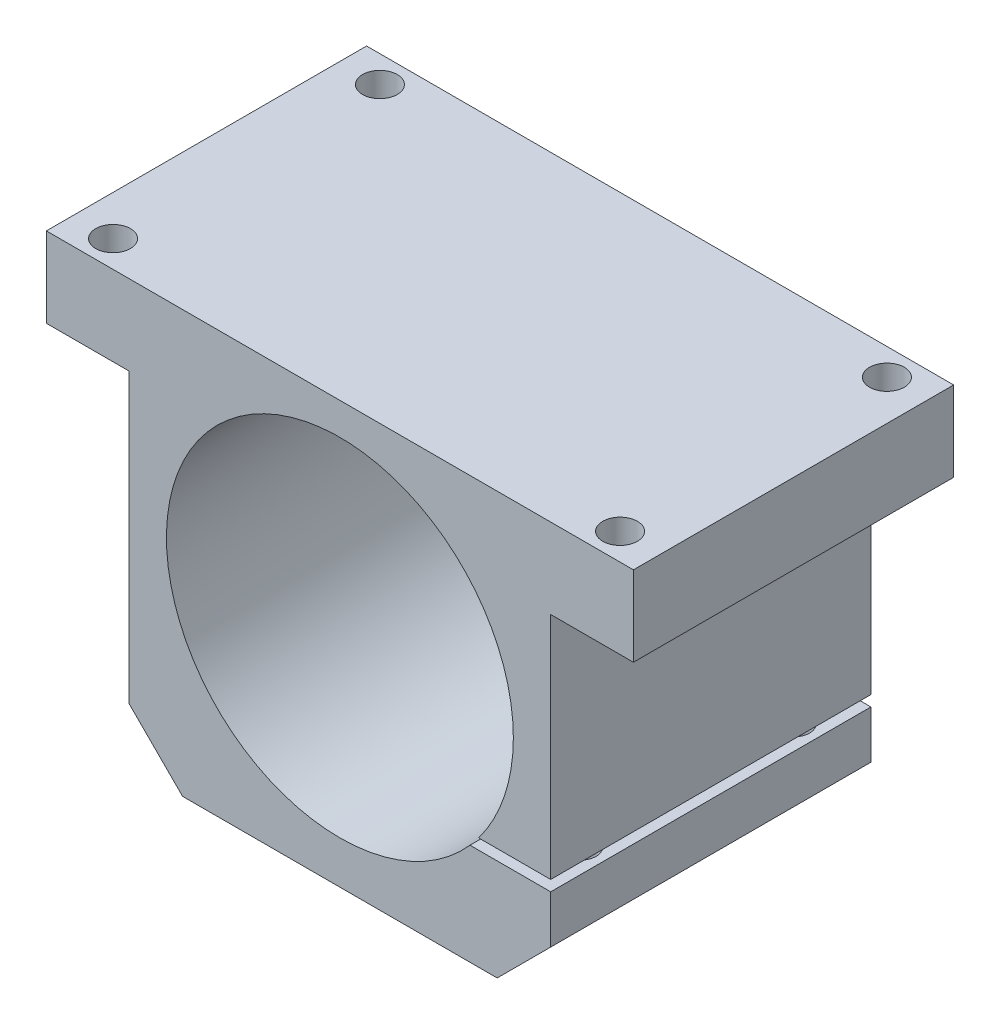
ISO-10303-21;
HEADER;
FILE_DESCRIPTION(('STEP AP214'),'2;1');
FILE_NAME('part.step','',(''),(''),'','','');
FILE_SCHEMA(('AUTOMOTIVE_DESIGN { 1 0 10303 214 1 1 1 1 }'));
ENDSEC;
DATA;
#1=APPLICATION_CONTEXT('core data for automotive mechanical design processes');
#2=APPLICATION_PROTOCOL_DEFINITION('international standard','automotive_design',2000,#1);
#3=PRODUCT_CONTEXT('',#1,'mechanical');
#4=PRODUCT('Part','Part','',(#3));
#5=PRODUCT_RELATED_PRODUCT_CATEGORY('part','',(#4));
#6=PRODUCT_DEFINITION_FORMATION('','',#4);
#7=PRODUCT_DEFINITION_CONTEXT('part definition',#1,'design');
#8=PRODUCT_DEFINITION('design','',#6,#7);
#9=PRODUCT_DEFINITION_SHAPE('','',#8);
#10=(LENGTH_UNIT() NAMED_UNIT(*) SI_UNIT(.MILLI.,.METRE.));
#11=(NAMED_UNIT(*) PLANE_ANGLE_UNIT() SI_UNIT($,.RADIAN.));
#12=(NAMED_UNIT(*) SI_UNIT($,.STERADIAN.) SOLID_ANGLE_UNIT());
#13=UNCERTAINTY_MEASURE_WITH_UNIT(LENGTH_MEASURE(1.E-05),#10,'distance_accuracy_value','');
#14=(GEOMETRIC_REPRESENTATION_CONTEXT(3) GLOBAL_UNCERTAINTY_ASSIGNED_CONTEXT((#13)) GLOBAL_UNIT_ASSIGNED_CONTEXT((#10,
#11,#12)) REPRESENTATION_CONTEXT('',''));
#15=CARTESIAN_POINT('',(0.,0.,0.));
#16=DIRECTION('',(0.,0.,1.));
#17=DIRECTION('',(1.,0.,0.));
#18=AXIS2_PLACEMENT_3D('',#15,#16,#17);
#19=CARTESIAN_POINT('',(90.,-47.,50.));
#20=DIRECTION('',(0.,-1.,0.));
#21=DIRECTION('',(0.,0.,-1.));
#22=AXIS2_PLACEMENT_3D('',#19,#20,#21);
#23=PLANE('',#22);
#24=CARTESIAN_POINT('',(90.,-47.,50.));
#25=DIRECTION('',(0.,-1.,0.));
#26=DIRECTION('',(1.,0.,0.));
#27=AXIS2_PLACEMENT_3D('',#24,#25,#26);
#28=CIRCLE('',#27,3.);
#29=CARTESIAN_POINT('',(93.,-47.,50.));
#30=VERTEX_POINT('',#29);
#31=EDGE_CURVE('E411',#30,#30,#28,.T.);
#32=ORIENTED_EDGE('',*,*,#31,.T.);
#33=EDGE_LOOP('',(#32));
#34=FACE_BOUND('',#33,.T.);
#35=ADVANCED_FACE('F16',(#34),#23,.T.);
#36=CARTESIAN_POINT('',(90.,-47.,10.));
#37=DIRECTION('',(0.,-1.,0.));
#38=DIRECTION('',(0.,0.,-1.));
#39=AXIS2_PLACEMENT_3D('',#36,#37,#38);
#40=PLANE('',#39);
#41=CARTESIAN_POINT('',(90.,-47.,10.));
#42=DIRECTION('',(0.,-1.,0.));
#43=DIRECTION('',(1.,0.,0.));
#44=AXIS2_PLACEMENT_3D('',#41,#42,#43);
#45=CIRCLE('',#44,3.);
#46=CARTESIAN_POINT('',(93.,-47.,10.));
#47=VERTEX_POINT('',#46);
#48=EDGE_CURVE('E254',#47,#47,#45,.T.);
#49=ORIENTED_EDGE('',*,*,#48,.T.);
#50=EDGE_LOOP('',(#49));
#51=FACE_BOUND('',#50,.T.);
#52=ADVANCED_FACE('F648',(#51),#40,.T.);
#53=CARTESIAN_POINT('',(90.,-69.,10.));
#54=DIRECTION('',(0.,-1.,0.));
#55=DIRECTION('',(0.,0.,-1.));
#56=AXIS2_PLACEMENT_3D('',#53,#54,#55);
#57=PLANE('',#56);
#58=CARTESIAN_POINT('',(90.,-69.,10.));
#59=DIRECTION('',(0.,-1.,0.));
#60=DIRECTION('',(1.,0.,0.));
#61=AXIS2_PLACEMENT_3D('',#58,#59,#60);
#62=CIRCLE('',#61,3.);
#63=CARTESIAN_POINT('',(93.,-69.,10.));
#64=VERTEX_POINT('',#63);
#65=EDGE_CURVE('E345',#64,#64,#62,.T.);
#66=ORIENTED_EDGE('',*,*,#65,.F.);
#67=EDGE_LOOP('',(#66));
#68=FACE_BOUND('',#67,.T.);
#69=DIRECTION('',(0.,0.,1.));
#70=VECTOR('',#69,1.);
#71=CARTESIAN_POINT('',(94.473088065419,-69.,0.5));
#72=LINE('',#71,#70);
#73=CARTESIAN_POINT('',(94.473088065419,-69.,6.001064746835));
#74=VERTEX_POINT('',#73);
#75=CARTESIAN_POINT('',(94.473088065419,-69.,13.998935253165));
#76=VERTEX_POINT('',#75);
#77=EDGE_CURVE('E326',#74,#76,#72,.T.);
#78=ORIENTED_EDGE('',*,*,#77,.T.);
#79=CARTESIAN_POINT('',(90.,-69.,10.));
#80=DIRECTION('',(0.,-1.,0.));
#81=DIRECTION('',(1.,0.,0.));
#82=AXIS2_PLACEMENT_3D('',#79,#80,#81);
#83=CIRCLE('',#82,6.);
#84=EDGE_CURVE('E11',#76,#74,#83,.T.);
#85=ORIENTED_EDGE('',*,*,#84,.T.);
#86=EDGE_LOOP('',(#78,#85));
#87=FACE_BOUND('',#86,.T.);
#88=ADVANCED_FACE('F654',(#68,#87),#57,.T.);
#89=CARTESIAN_POINT('',(90.,-69.,10.));
#90=DIRECTION('',(0.,-1.,0.));
#91=DIRECTION('',(1.,0.,0.));
#92=AXIS2_PLACEMENT_3D('',#89,#90,#91);
#93=CYLINDRICAL_SURFACE('',#92,6.);
#94=CARTESIAN_POINT('',(90.,-79.,10.));
#95=DIRECTION('',(0.,-1.,0.));
#96=DIRECTION('',(1.,0.,0.));
#97=AXIS2_PLACEMENT_3D('',#94,#95,#96);
#98=CIRCLE('',#97,6.);
#99=CARTESIAN_POINT('',(84.473088065419,-79.,12.335218291164));
#100=VERTEX_POINT('',#99);
#101=CARTESIAN_POINT('',(84.473088065419,-79.,7.664781708836));
#102=VERTEX_POINT('',#101);
#103=EDGE_CURVE('E273',#100,#102,#98,.T.);
#104=ORIENTED_EDGE('',*,*,#103,.T.);
#105=CARTESIAN_POINT('',(90.,-73.47308806541,10.));
#106=DIRECTION('',(-0.707106781186548,0.707106781186548,0.));
#107=DIRECTION('',(-0.707106781186548,-0.707106781186548,0.));
#108=AXIS2_PLACEMENT_3D('',#105,#106,#107);
#109=ELLIPSE('',#108,8.485281374239,6.);
#110=EDGE_CURVE('E312',#74,#102,#109,.T.);
#111=ORIENTED_EDGE('',*,*,#110,.F.);
#112=ORIENTED_EDGE('',*,*,#84,.F.);
#113=CARTESIAN_POINT('',(90.,-73.47308806541,10.));
#114=DIRECTION('',(-0.707106781186548,0.707106781186548,0.));
#115=DIRECTION('',(-0.707106781186548,-0.707106781186548,0.));
#116=AXIS2_PLACEMENT_3D('',#113,#114,#115);
#117=ELLIPSE('',#116,8.485281374239,6.);
#118=EDGE_CURVE('E351',#100,#76,#117,.T.);
#119=ORIENTED_EDGE('',*,*,#118,.F.);
#120=EDGE_LOOP('',(#104,#111,#112,#119));
#121=FACE_BOUND('',#120,.T.);
#122=ADVANCED_FACE('F714',(#121),#93,.F.);
#123=CARTESIAN_POINT('',(90.,-69.,50.));
#124=DIRECTION('',(0.,-1.,0.));
#125=DIRECTION('',(0.,0.,-1.));
#126=AXIS2_PLACEMENT_3D('',#123,#124,#125);
#127=PLANE('',#126);
#128=CARTESIAN_POINT('',(90.,-69.,50.));
#129=DIRECTION('',(0.,-1.,0.));
#130=DIRECTION('',(1.,0.,0.));
#131=AXIS2_PLACEMENT_3D('',#128,#129,#130);
#132=CIRCLE('',#131,3.);
#133=CARTESIAN_POINT('',(93.,-69.,50.));
#134=VERTEX_POINT('',#133);
#135=EDGE_CURVE('E41',#134,#134,#132,.T.);
#136=ORIENTED_EDGE('',*,*,#135,.F.);
#137=EDGE_LOOP('',(#136));
#138=FACE_BOUND('',#137,.T.);
#139=DIRECTION('',(0.,0.,1.));
#140=VECTOR('',#139,1.);
#141=CARTESIAN_POINT('',(94.473088065419,-69.,20.5));
#142=LINE('',#141,#140);
#143=CARTESIAN_POINT('',(94.473088065419,-69.,46.001064746835));
#144=VERTEX_POINT('',#143);
#145=CARTESIAN_POINT('',(94.473088065419,-69.,53.998935253165));
#146=VERTEX_POINT('',#145);
#147=EDGE_CURVE('E306',#144,#146,#142,.T.);
#148=ORIENTED_EDGE('',*,*,#147,.T.);
#149=CARTESIAN_POINT('',(90.,-69.,50.));
#150=DIRECTION('',(0.,-1.,0.));
#151=DIRECTION('',(1.,0.,0.));
#152=AXIS2_PLACEMENT_3D('',#149,#150,#151);
#153=CIRCLE('',#152,6.);
#154=EDGE_CURVE('E27',#146,#144,#153,.T.);
#155=ORIENTED_EDGE('',*,*,#154,.T.);
#156=EDGE_LOOP('',(#148,#155));
#157=FACE_BOUND('',#156,.T.);
#158=ADVANCED_FACE('F658',(#138,#157),#127,.T.);
#159=CARTESIAN_POINT('',(90.,-69.,50.));
#160=DIRECTION('',(0.,-1.,0.));
#161=DIRECTION('',(1.,0.,0.));
#162=AXIS2_PLACEMENT_3D('',#159,#160,#161);
#163=CYLINDRICAL_SURFACE('',#162,6.);
#164=CARTESIAN_POINT('',(90.,-79.,50.));
#165=DIRECTION('',(0.,-1.,0.));
#166=DIRECTION('',(1.,0.,0.));
#167=AXIS2_PLACEMENT_3D('',#164,#165,#166);
#168=CIRCLE('',#167,6.);
#169=CARTESIAN_POINT('',(84.473088065419,-79.,52.335218291164));
#170=VERTEX_POINT('',#169);
#171=CARTESIAN_POINT('',(84.473088065419,-79.,47.664781708836));
#172=VERTEX_POINT('',#171);
#173=EDGE_CURVE('E77',#170,#172,#168,.T.);
#174=ORIENTED_EDGE('',*,*,#173,.T.);
#175=CARTESIAN_POINT('',(90.,-73.47308806541,50.));
#176=DIRECTION('',(-0.707106781186548,0.707106781186548,0.));
#177=DIRECTION('',(-0.707106781186548,-0.707106781186548,0.));
#178=AXIS2_PLACEMENT_3D('',#175,#176,#177);
#179=ELLIPSE('',#178,8.485281374239,6.);
#180=EDGE_CURVE('E301',#144,#172,#179,.T.);
#181=ORIENTED_EDGE('',*,*,#180,.F.);
#182=ORIENTED_EDGE('',*,*,#154,.F.);
#183=CARTESIAN_POINT('',(90.,-73.47308806541,50.));
#184=DIRECTION('',(-0.707106781186548,0.707106781186548,0.));
#185=DIRECTION('',(-0.707106781186548,-0.707106781186548,0.));
#186=AXIS2_PLACEMENT_3D('',#183,#184,#185);
#187=ELLIPSE('',#186,8.485281374239,6.);
#188=EDGE_CURVE('E300',#170,#146,#187,.T.);
#189=ORIENTED_EDGE('',*,*,#188,.F.);
#190=EDGE_LOOP('',(#174,#181,#182,#189));
#191=FACE_BOUND('',#190,.T.);
#192=ADVANCED_FACE('F711',(#191),#163,.F.);
#193=CARTESIAN_POINT('',(90.,-47.,50.));
#194=DIRECTION('',(0.,-1.,0.));
#195=DIRECTION('',(1.,0.,0.));
#196=AXIS2_PLACEMENT_3D('',#193,#194,#195);
#197=CYLINDRICAL_SURFACE('',#196,3.);
#198=DIRECTION('',(0.,-1.,0.));
#199=VECTOR('',#198,1.);
#200=CARTESIAN_POINT('',(93.,-47.,50.));
#201=LINE('',#200,#199);
#202=CARTESIAN_POINT('',(93.,-60.,50.));
#203=VERTEX_POINT('',#202);
#204=EDGE_CURVE('E266',#203,#134,#201,.T.);
#205=ORIENTED_EDGE('',*,*,#204,.F.);
#206=CARTESIAN_POINT('',(90.,-60.,50.));
#207=DIRECTION('',(0.,-1.,0.));
#208=DIRECTION('',(1.,0.,0.));
#209=AXIS2_PLACEMENT_3D('',#206,#207,#208);
#210=CIRCLE('',#209,3.);
#211=EDGE_CURVE('E242',#203,#203,#210,.T.);
#212=ORIENTED_EDGE('',*,*,#211,.F.);
#213=ORIENTED_EDGE('',*,*,#204,.T.);
#214=ORIENTED_EDGE('',*,*,#135,.T.);
#215=EDGE_LOOP('',(#205,#212,#213,#214));
#216=FACE_BOUND('',#215,.T.);
#217=ADVANCED_FACE('F677',(#216),#197,.F.);
#218=CARTESIAN_POINT('',(90.,-47.,10.));
#219=DIRECTION('',(0.,-1.,0.));
#220=DIRECTION('',(1.,0.,0.));
#221=AXIS2_PLACEMENT_3D('',#218,#219,#220);
#222=CYLINDRICAL_SURFACE('',#221,3.);
#223=DIRECTION('',(0.,-1.,0.));
#224=VECTOR('',#223,1.);
#225=CARTESIAN_POINT('',(93.,-47.,10.));
#226=LINE('',#225,#224);
#227=CARTESIAN_POINT('',(93.,-60.,10.));
#228=VERTEX_POINT('',#227);
#229=EDGE_CURVE('E418',#228,#64,#226,.T.);
#230=ORIENTED_EDGE('',*,*,#229,.F.);
#231=CARTESIAN_POINT('',(90.,-60.,10.));
#232=DIRECTION('',(0.,-1.,0.));
#233=DIRECTION('',(1.,0.,0.));
#234=AXIS2_PLACEMENT_3D('',#231,#232,#233);
#235=CIRCLE('',#234,3.);
#236=EDGE_CURVE('E363',#228,#228,#235,.T.);
#237=ORIENTED_EDGE('',*,*,#236,.F.);
#238=ORIENTED_EDGE('',*,*,#229,.T.);
#239=ORIENTED_EDGE('',*,*,#65,.T.);
#240=EDGE_LOOP('',(#230,#237,#238,#239));
#241=FACE_BOUND('',#240,.T.);
#242=ADVANCED_FACE('F674',(#241),#222,.F.);
#243=CARTESIAN_POINT('',(90.,-47.,50.));
#244=DIRECTION('',(0.,-1.,0.));
#245=DIRECTION('',(1.,0.,0.));
#246=AXIS2_PLACEMENT_3D('',#243,#244,#245);
#247=CYLINDRICAL_SURFACE('',#246,3.);
#248=DIRECTION('',(0.,-1.,0.));
#249=VECTOR('',#248,1.);
#250=CARTESIAN_POINT('',(93.,-47.,50.));
#251=LINE('',#250,#249);
#252=CARTESIAN_POINT('',(93.,-58.,50.));
#253=VERTEX_POINT('',#252);
#254=EDGE_CURVE('E329',#30,#253,#251,.T.);
#255=ORIENTED_EDGE('',*,*,#254,.F.);
#256=ORIENTED_EDGE('',*,*,#31,.F.);
#257=ORIENTED_EDGE('',*,*,#254,.T.);
#258=CARTESIAN_POINT('',(90.,-58.,50.));
#259=DIRECTION('',(0.,-1.,0.));
#260=DIRECTION('',(1.,0.,0.));
#261=AXIS2_PLACEMENT_3D('',#258,#259,#260);
#262=CIRCLE('',#261,3.);
#263=EDGE_CURVE('E609',#253,#253,#262,.T.);
#264=ORIENTED_EDGE('',*,*,#263,.T.);
#265=EDGE_LOOP('',(#255,#256,#257,#264));
#266=FACE_BOUND('',#265,.T.);
#267=ADVANCED_FACE('F676',(#266),#247,.F.);
#268=CARTESIAN_POINT('',(90.,-47.,10.));
#269=DIRECTION('',(0.,-1.,0.));
#270=DIRECTION('',(1.,0.,0.));
#271=AXIS2_PLACEMENT_3D('',#268,#269,#270);
#272=CYLINDRICAL_SURFACE('',#271,3.);
#273=DIRECTION('',(0.,-1.,0.));
#274=VECTOR('',#273,1.);
#275=CARTESIAN_POINT('',(93.,-47.,10.));
#276=LINE('',#275,#274);
#277=CARTESIAN_POINT('',(93.,-58.,10.));
#278=VERTEX_POINT('',#277);
#279=EDGE_CURVE('E186',#47,#278,#276,.T.);
#280=ORIENTED_EDGE('',*,*,#279,.F.);
#281=ORIENTED_EDGE('',*,*,#48,.F.);
#282=ORIENTED_EDGE('',*,*,#279,.T.);
#283=CARTESIAN_POINT('',(90.,-58.,10.));
#284=DIRECTION('',(0.,-1.,0.));
#285=DIRECTION('',(1.,0.,0.));
#286=AXIS2_PLACEMENT_3D('',#283,#284,#285);
#287=CIRCLE('',#286,3.);
#288=EDGE_CURVE('E20',#278,#278,#287,.T.);
#289=ORIENTED_EDGE('',*,*,#288,.T.);
#290=EDGE_LOOP('',(#280,#281,#282,#289));
#291=FACE_BOUND('',#290,.T.);
#292=ADVANCED_FACE('F707',(#291),#272,.F.);
#293=CARTESIAN_POINT('',(102.5,4.,5.));
#294=DIRECTION('',(0.,-1.,0.));
#295=DIRECTION('',(1.,0.,0.));
#296=AXIS2_PLACEMENT_3D('',#293,#294,#295);
#297=CYLINDRICAL_SURFACE('',#296,3.25);
#298=DIRECTION('',(0.,-1.,0.));
#299=VECTOR('',#298,1.);
#300=CARTESIAN_POINT('',(105.75,4.,5.));
#301=LINE('',#300,#299);
#302=CARTESIAN_POINT('',(105.75,0.,5.));
#303=VERTEX_POINT('',#302);
#304=CARTESIAN_POINT('',(105.75,-15.,5.));
#305=VERTEX_POINT('',#304);
#306=EDGE_CURVE('E179',#303,#305,#301,.T.);
#307=ORIENTED_EDGE('',*,*,#306,.F.);
#308=CARTESIAN_POINT('',(102.5,0.,5.));
#309=DIRECTION('',(0.,-1.,0.));
#310=DIRECTION('',(1.,0.,0.));
#311=AXIS2_PLACEMENT_3D('',#308,#309,#310);
#312=CIRCLE('',#311,3.25);
#313=EDGE_CURVE('E182',#303,#303,#312,.T.);
#314=ORIENTED_EDGE('',*,*,#313,.F.);
#315=ORIENTED_EDGE('',*,*,#306,.T.);
#316=CARTESIAN_POINT('',(102.5,-15.,5.));
#317=DIRECTION('',(0.,-1.,0.));
#318=DIRECTION('',(1.,0.,0.));
#319=AXIS2_PLACEMENT_3D('',#316,#317,#318);
#320=CIRCLE('',#319,3.25);
#321=EDGE_CURVE('E184',#305,#305,#320,.T.);
#322=ORIENTED_EDGE('',*,*,#321,.T.);
#323=EDGE_LOOP('',(#307,#314,#315,#322));
#324=FACE_BOUND('',#323,.T.);
#325=ADVANCED_FACE('F181',(#324),#297,.F.);
#326=CARTESIAN_POINT('',(102.5,4.,55.));
#327=DIRECTION('',(0.,-1.,0.));
#328=DIRECTION('',(1.,0.,0.));
#329=AXIS2_PLACEMENT_3D('',#326,#327,#328);
#330=CYLINDRICAL_SURFACE('',#329,3.25);
#331=DIRECTION('',(0.,-1.,0.));
#332=VECTOR('',#331,1.);
#333=CARTESIAN_POINT('',(105.75,4.,55.));
#334=LINE('',#333,#332);
#335=CARTESIAN_POINT('',(105.75,0.,55.));
#336=VERTEX_POINT('',#335);
#337=CARTESIAN_POINT('',(105.75,-15.,55.));
#338=VERTEX_POINT('',#337);
#339=EDGE_CURVE('E187',#336,#338,#334,.T.);
#340=ORIENTED_EDGE('',*,*,#339,.F.);
#341=CARTESIAN_POINT('',(102.5,0.,55.));
#342=DIRECTION('',(0.,-1.,0.));
#343=DIRECTION('',(1.,0.,0.));
#344=AXIS2_PLACEMENT_3D('',#341,#342,#343);
#345=CIRCLE('',#344,3.25);
#346=EDGE_CURVE('E194',#336,#336,#345,.T.);
#347=ORIENTED_EDGE('',*,*,#346,.F.);
#348=ORIENTED_EDGE('',*,*,#339,.T.);
#349=CARTESIAN_POINT('',(102.5,-15.,55.));
#350=DIRECTION('',(0.,-1.,0.));
#351=DIRECTION('',(1.,0.,0.));
#352=AXIS2_PLACEMENT_3D('',#349,#350,#351);
#353=CIRCLE('',#352,3.25);
#354=EDGE_CURVE('E381',#338,#338,#353,.T.);
#355=ORIENTED_EDGE('',*,*,#354,.T.);
#356=EDGE_LOOP('',(#340,#347,#348,#355));
#357=FACE_BOUND('',#356,.T.);
#358=ADVANCED_FACE('F694',(#357),#330,.F.);
#359=CARTESIAN_POINT('',(7.5,4.,55.));
#360=DIRECTION('',(0.,-1.,0.));
#361=DIRECTION('',(1.,0.,0.));
#362=AXIS2_PLACEMENT_3D('',#359,#360,#361);
#363=CYLINDRICAL_SURFACE('',#362,3.25);
#364=DIRECTION('',(0.,-1.,0.));
#365=VECTOR('',#364,1.);
#366=CARTESIAN_POINT('',(10.75,4.,55.));
#367=LINE('',#366,#365);
#368=CARTESIAN_POINT('',(10.75,0.,55.));
#369=VERTEX_POINT('',#368);
#370=CARTESIAN_POINT('',(10.75,-15.,55.));
#371=VERTEX_POINT('',#370);
#372=EDGE_CURVE('E322',#369,#371,#367,.T.);
#373=ORIENTED_EDGE('',*,*,#372,.F.);
#374=CARTESIAN_POINT('',(7.5,0.,55.));
#375=DIRECTION('',(0.,-1.,0.));
#376=DIRECTION('',(1.,0.,0.));
#377=AXIS2_PLACEMENT_3D('',#374,#375,#376);
#378=CIRCLE('',#377,3.25);
#379=EDGE_CURVE('E205',#369,#369,#378,.T.);
#380=ORIENTED_EDGE('',*,*,#379,.F.);
#381=ORIENTED_EDGE('',*,*,#372,.T.);
#382=CARTESIAN_POINT('',(7.5,-15.,55.));
#383=DIRECTION('',(0.,-1.,0.));
#384=DIRECTION('',(1.,0.,0.));
#385=AXIS2_PLACEMENT_3D('',#382,#383,#384);
#386=CIRCLE('',#385,3.25);
#387=EDGE_CURVE('E334',#371,#371,#386,.T.);
#388=ORIENTED_EDGE('',*,*,#387,.T.);
#389=EDGE_LOOP('',(#373,#380,#381,#388));
#390=FACE_BOUND('',#389,.T.);
#391=ADVANCED_FACE('F626',(#390),#363,.F.);
#392=CARTESIAN_POINT('',(7.5,4.,5.));
#393=DIRECTION('',(0.,-1.,0.));
#394=DIRECTION('',(1.,0.,0.));
#395=AXIS2_PLACEMENT_3D('',#392,#393,#394);
#396=CYLINDRICAL_SURFACE('',#395,3.25);
#397=DIRECTION('',(0.,-1.,0.));
#398=VECTOR('',#397,1.);
#399=CARTESIAN_POINT('',(10.75,4.,5.));
#400=LINE('',#399,#398);
#401=CARTESIAN_POINT('',(10.75,0.,5.));
#402=VERTEX_POINT('',#401);
#403=CARTESIAN_POINT('',(10.75,-15.,5.));
#404=VERTEX_POINT('',#403);
#405=EDGE_CURVE('E316',#402,#404,#400,.T.);
#406=ORIENTED_EDGE('',*,*,#405,.F.);
#407=CARTESIAN_POINT('',(7.5,0.,5.));
#408=DIRECTION('',(0.,-1.,0.));
#409=DIRECTION('',(1.,0.,0.));
#410=AXIS2_PLACEMENT_3D('',#407,#408,#409);
#411=CIRCLE('',#410,3.25);
#412=EDGE_CURVE('E249',#402,#402,#411,.T.);
#413=ORIENTED_EDGE('',*,*,#412,.F.);
#414=ORIENTED_EDGE('',*,*,#405,.T.);
#415=CARTESIAN_POINT('',(7.5,-15.,5.));
#416=DIRECTION('',(0.,-1.,0.));
#417=DIRECTION('',(1.,0.,0.));
#418=AXIS2_PLACEMENT_3D('',#415,#416,#417);
#419=CIRCLE('',#418,3.25);
#420=EDGE_CURVE('E339',#404,#404,#419,.T.);
#421=ORIENTED_EDGE('',*,*,#420,.T.);
#422=EDGE_LOOP('',(#406,#413,#414,#421));
#423=FACE_BOUND('',#422,.T.);
#424=ADVANCED_FACE('F634',(#423),#396,.F.);
#425=CARTESIAN_POINT('',(15.5,-15.,-5.));
#426=DIRECTION('',(1.,0.,0.));
#427=DIRECTION('',(0.,1.,0.));
#428=AXIS2_PLACEMENT_3D('',#425,#426,#427);
#429=PLANE('',#428);
#430=DIRECTION('',(0.,1.,0.));
#431=VECTOR('',#430,1.);
#432=CARTESIAN_POINT('',(15.5,-7.5,60.));
#433=LINE('',#432,#431);
#434=CARTESIAN_POINT('',(15.5,-68.97308806541,60.));
#435=VERTEX_POINT('',#434);
#436=CARTESIAN_POINT('',(15.5,-15.,60.));
#437=VERTEX_POINT('',#436);
#438=EDGE_CURVE('E422',#435,#437,#433,.T.);
#439=ORIENTED_EDGE('',*,*,#438,.T.);
#440=DIRECTION('',(0.,0.,1.));
#441=VECTOR('',#440,1.);
#442=CARTESIAN_POINT('',(15.5,-15.,-5.));
#443=LINE('',#442,#441);
#444=CARTESIAN_POINT('',(15.5,-15.,0.));
#445=VERTEX_POINT('',#444);
#446=EDGE_CURVE('E388',#445,#437,#443,.T.);
#447=ORIENTED_EDGE('',*,*,#446,.F.);
#448=DIRECTION('',(0.,1.,0.));
#449=VECTOR('',#448,1.);
#450=CARTESIAN_POINT('',(15.5,-7.5,0.));
#451=LINE('',#450,#449);
#452=CARTESIAN_POINT('',(15.5,-68.97308806541,0.));
#453=VERTEX_POINT('',#452);
#454=EDGE_CURVE('E444',#453,#445,#451,.T.);
#455=ORIENTED_EDGE('',*,*,#454,.F.);
#456=DIRECTION('',(0.,0.,1.));
#457=VECTOR('',#456,1.);
#458=CARTESIAN_POINT('',(15.5,-68.97308806541,-7.));
#459=LINE('',#458,#457);
#460=EDGE_CURVE('E272',#453,#435,#459,.T.);
#461=ORIENTED_EDGE('',*,*,#460,.T.);
#462=EDGE_LOOP('',(#439,#447,#455,#461));
#463=FACE_BOUND('',#462,.T.);
#464=ADVANCED_FACE('F18',(#463),#429,.F.);
#465=CARTESIAN_POINT('',(8.263455967291,-61.7365440327,-9.));
#466=DIRECTION('',(0.707106781186548,0.707106781186548,0.));
#467=DIRECTION('',(0.,0.,-1.));
#468=AXIS2_PLACEMENT_3D('',#465,#466,#467);
#469=PLANE('',#468);
#470=DIRECTION('',(-0.707106781186548,0.707106781186548,0.));
#471=VECTOR('',#470,1.);
#472=CARTESIAN_POINT('',(-9.236544032709,-44.2365440327,60.));
#473=LINE('',#472,#471);
#474=CARTESIAN_POINT('',(25.526911934581,-79.,60.));
#475=VERTEX_POINT('',#474);
#476=EDGE_CURVE('E214',#475,#435,#473,.T.);
#477=ORIENTED_EDGE('',*,*,#476,.T.);
#478=ORIENTED_EDGE('',*,*,#460,.F.);
#479=DIRECTION('',(-0.707106781186548,0.707106781186548,0.));
#480=VECTOR('',#479,1.);
#481=CARTESIAN_POINT('',(-9.236544032709,-44.2365440327,0.));
#482=LINE('',#481,#480);
#483=CARTESIAN_POINT('',(25.526911934581,-79.,0.));
#484=VERTEX_POINT('',#483);
#485=EDGE_CURVE('E209',#484,#453,#482,.T.);
#486=ORIENTED_EDGE('',*,*,#485,.F.);
#487=DIRECTION('',(0.,0.,1.));
#488=VECTOR('',#487,1.);
#489=CARTESIAN_POINT('',(25.526911934581,-79.,-4.5));
#490=LINE('',#489,#488);
#491=EDGE_CURVE('E311',#484,#475,#490,.T.);
#492=ORIENTED_EDGE('',*,*,#491,.T.);
#493=EDGE_LOOP('',(#477,#478,#486,#492));
#494=FACE_BOUND('',#493,.T.);
#495=ADVANCED_FACE('F467',(#494),#469,.F.);
#496=CARTESIAN_POINT('',(0.,-79.,0.));
#497=DIRECTION('',(0.,-1.,0.));
#498=DIRECTION('',(0.,0.,-1.));
#499=AXIS2_PLACEMENT_3D('',#496,#497,#498);
#500=PLANE('',#499);
#501=DIRECTION('',(1.,0.,0.));
#502=VECTOR('',#501,1.);
#503=CARTESIAN_POINT('',(0.,-79.,60.));
#504=LINE('',#503,#502);
#505=CARTESIAN_POINT('',(84.473088065419,-79.,60.));
#506=VERTEX_POINT('',#505);
#507=EDGE_CURVE('E211',#475,#506,#504,.T.);
#508=ORIENTED_EDGE('',*,*,#507,.F.);
#509=ORIENTED_EDGE('',*,*,#491,.F.);
#510=DIRECTION('',(1.,0.,0.));
#511=VECTOR('',#510,1.);
#512=CARTESIAN_POINT('',(0.,-79.,0.));
#513=LINE('',#512,#511);
#514=CARTESIAN_POINT('',(84.473088065419,-79.,0.));
#515=VERTEX_POINT('',#514);
#516=EDGE_CURVE('E255',#484,#515,#513,.T.);
#517=ORIENTED_EDGE('',*,*,#516,.T.);
#518=DIRECTION('',(0.,0.,-1.));
#519=VECTOR('',#518,1.);
#520=CARTESIAN_POINT('',(84.473088065419,-79.,-4.5));
#521=LINE('',#520,#519);
#522=EDGE_CURVE('E307',#102,#515,#521,.T.);
#523=ORIENTED_EDGE('',*,*,#522,.F.);
#524=ORIENTED_EDGE('',*,*,#103,.F.);
#525=DIRECTION('',(0.,0.,-1.));
#526=VECTOR('',#525,1.);
#527=CARTESIAN_POINT('',(84.473088065419,-79.,-4.5));
#528=LINE('',#527,#526);
#529=EDGE_CURVE('E305',#172,#100,#528,.T.);
#530=ORIENTED_EDGE('',*,*,#529,.F.);
#531=ORIENTED_EDGE('',*,*,#173,.F.);
#532=DIRECTION('',(0.,0.,-1.));
#533=VECTOR('',#532,1.);
#534=CARTESIAN_POINT('',(84.473088065419,-79.,-4.5));
#535=LINE('',#534,#533);
#536=EDGE_CURVE('E241',#506,#170,#535,.T.);
#537=ORIENTED_EDGE('',*,*,#536,.F.);
#538=EDGE_LOOP('',(#508,#509,#517,#523,#524,#530,#531,#537));
#539=FACE_BOUND('',#538,.T.);
#540=ADVANCED_FACE('F670',(#539),#500,.T.);
#541=CARTESIAN_POINT('',(62.736544032709,-100.7365440327,-9.));
#542=DIRECTION('',(-0.707106781186548,0.707106781186548,0.));
#543=DIRECTION('',(0.,0.,1.));
#544=AXIS2_PLACEMENT_3D('',#541,#542,#543);
#545=PLANE('',#544);
#546=DIRECTION('',(-0.707106781186548,-0.707106781186548,0.));
#547=VECTOR('',#546,1.);
#548=CARTESIAN_POINT('',(72.236544032709,-91.2365440327,60.));
#549=LINE('',#548,#547);
#550=CARTESIAN_POINT('',(94.5,-68.97308806541,60.));
#551=VERTEX_POINT('',#550);
#552=EDGE_CURVE('E213',#551,#506,#549,.T.);
#553=ORIENTED_EDGE('',*,*,#552,.T.);
#554=ORIENTED_EDGE('',*,*,#536,.T.);
#555=ORIENTED_EDGE('',*,*,#188,.T.);
#556=ORIENTED_EDGE('',*,*,#147,.F.);
#557=ORIENTED_EDGE('',*,*,#180,.T.);
#558=ORIENTED_EDGE('',*,*,#529,.T.);
#559=ORIENTED_EDGE('',*,*,#118,.T.);
#560=ORIENTED_EDGE('',*,*,#77,.F.);
#561=ORIENTED_EDGE('',*,*,#110,.T.);
#562=ORIENTED_EDGE('',*,*,#522,.T.);
#563=DIRECTION('',(-0.707106781186548,-0.707106781186548,0.));
#564=VECTOR('',#563,1.);
#565=CARTESIAN_POINT('',(72.236544032709,-91.2365440327,0.));
#566=LINE('',#565,#564);
#567=CARTESIAN_POINT('',(94.5,-68.97308806541,0.));
#568=VERTEX_POINT('',#567);
#569=EDGE_CURVE('E259',#568,#515,#566,.T.);
#570=ORIENTED_EDGE('',*,*,#569,.F.);
#571=DIRECTION('',(0.,0.,1.));
#572=VECTOR('',#571,1.);
#573=CARTESIAN_POINT('',(94.5,-68.97308806541,-7.));
#574=LINE('',#573,#572);
#575=EDGE_CURVE('E238',#568,#551,#574,.T.);
#576=ORIENTED_EDGE('',*,*,#575,.T.);
#577=EDGE_LOOP('',(#553,#554,#555,#556,#557,#558,#559,#560,#561,#562,#570,#576));
#578=FACE_BOUND('',#577,.T.);
#579=ADVANCED_FACE('F667',(#578),#545,.F.);
#580=CARTESIAN_POINT('',(94.5,-15.,-5.));
#581=DIRECTION('',(1.,0.,0.));
#582=DIRECTION('',(0.,1.,0.));
#583=AXIS2_PLACEMENT_3D('',#580,#581,#582);
#584=PLANE('',#583);
#585=ORIENTED_EDGE('',*,*,#575,.F.);
#586=DIRECTION('',(0.,1.,0.));
#587=VECTOR('',#586,1.);
#588=CARTESIAN_POINT('',(94.5,-7.5,0.));
#589=LINE('',#588,#587);
#590=CARTESIAN_POINT('',(94.5,-60.,0.));
#591=VERTEX_POINT('',#590);
#592=EDGE_CURVE('E230',#568,#591,#589,.T.);
#593=ORIENTED_EDGE('',*,*,#592,.T.);
#594=DIRECTION('',(0.,0.,-1.));
#595=VECTOR('',#594,1.);
#596=CARTESIAN_POINT('',(94.5,-60.,-5.));
#597=LINE('',#596,#595);
#598=CARTESIAN_POINT('',(94.5,-60.,60.));
#599=VERTEX_POINT('',#598);
#600=EDGE_CURVE('E151',#599,#591,#597,.T.);
#601=ORIENTED_EDGE('',*,*,#600,.F.);
#602=DIRECTION('',(0.,1.,0.));
#603=VECTOR('',#602,1.);
#604=CARTESIAN_POINT('',(94.5,-7.5,60.));
#605=LINE('',#604,#603);
#606=EDGE_CURVE('E348',#551,#599,#605,.T.);
#607=ORIENTED_EDGE('',*,*,#606,.F.);
#608=EDGE_LOOP('',(#585,#593,#601,#607));
#609=FACE_BOUND('',#608,.T.);
#610=ADVANCED_FACE('F519',(#609),#584,.T.);
#611=CARTESIAN_POINT('',(77.,-60.,-5.));
#612=DIRECTION('',(0.,-1.,0.));
#613=DIRECTION('',(0.,0.,-1.));
#614=AXIS2_PLACEMENT_3D('',#611,#612,#613);
#615=PLANE('',#614);
#616=ORIENTED_EDGE('',*,*,#211,.T.);
#617=EDGE_LOOP('',(#616));
#618=FACE_BOUND('',#617,.T.);
#619=ORIENTED_EDGE('',*,*,#236,.T.);
#620=EDGE_LOOP('',(#619));
#621=FACE_BOUND('',#620,.T.);
#622=DIRECTION('',(1.,0.,0.));
#623=VECTOR('',#622,1.);
#624=CARTESIAN_POINT('',(38.5,-60.,60.));
#625=LINE('',#624,#623);
#626=CARTESIAN_POINT('',(79.372115213908,-60.,60.));
#627=VERTEX_POINT('',#626);
#628=EDGE_CURVE('E269',#627,#599,#625,.T.);
#629=ORIENTED_EDGE('',*,*,#628,.T.);
#630=ORIENTED_EDGE('',*,*,#600,.T.);
#631=DIRECTION('',(1.,0.,0.));
#632=VECTOR('',#631,1.);
#633=CARTESIAN_POINT('',(38.5,-60.,0.));
#634=LINE('',#633,#632);
#635=CARTESIAN_POINT('',(79.372115213908,-60.,0.));
#636=VERTEX_POINT('',#635);
#637=EDGE_CURVE('E226',#636,#591,#634,.T.);
#638=ORIENTED_EDGE('',*,*,#637,.F.);
#639=DIRECTION('',(0.,0.,1.));
#640=VECTOR('',#639,1.);
#641=CARTESIAN_POINT('',(79.372115213908,-60.,-8.));
#642=LINE('',#641,#640);
#643=EDGE_CURVE('E166',#636,#627,#642,.T.);
#644=ORIENTED_EDGE('',*,*,#643,.T.);
#645=EDGE_LOOP('',(#629,#630,#638,#644));
#646=FACE_BOUND('',#645,.T.);
#647=ADVANCED_FACE('F522',(#618,#621,#646),#615,.F.);
#648=CARTESIAN_POINT('',(55.,-38.5,-8.));
#649=DIRECTION('',(0.,0.,1.));
#650=DIRECTION('',(1.,0.,0.));
#651=AXIS2_PLACEMENT_3D('',#648,#649,#650);
#652=CYLINDRICAL_SURFACE('',#651,32.5);
#653=ORIENTED_EDGE('',*,*,#643,.F.);
#654=CARTESIAN_POINT('',(55.,-38.5,0.));
#655=DIRECTION('',(0.,0.,1.));
#656=DIRECTION('',(1.,0.,0.));
#657=AXIS2_PLACEMENT_3D('',#654,#655,#656);
#658=CIRCLE('',#657,32.5);
#659=CARTESIAN_POINT('',(87.5,-38.5,0.));
#660=VERTEX_POINT('',#659);
#661=EDGE_CURVE('E231',#660,#636,#658,.T.);
#662=ORIENTED_EDGE('',*,*,#661,.F.);
#663=DIRECTION('',(0.,0.,1.));
#664=VECTOR('',#663,1.);
#665=CARTESIAN_POINT('',(87.5,-38.5,-8.));
#666=LINE('',#665,#664);
#667=CARTESIAN_POINT('',(87.5,-38.5,60.));
#668=VERTEX_POINT('',#667);
#669=EDGE_CURVE('E278',#660,#668,#666,.T.);
#670=ORIENTED_EDGE('',*,*,#669,.T.);
#671=CARTESIAN_POINT('',(55.,-38.5,60.));
#672=DIRECTION('',(0.,0.,1.));
#673=DIRECTION('',(1.,0.,0.));
#674=AXIS2_PLACEMENT_3D('',#671,#672,#673);
#675=CIRCLE('',#674,32.5);
#676=EDGE_CURVE('E237',#668,#627,#675,.T.);
#677=ORIENTED_EDGE('',*,*,#676,.T.);
#678=EDGE_LOOP('',(#653,#662,#670,#677));
#679=FACE_BOUND('',#678,.T.);
#680=ADVANCED_FACE('F527',(#679),#652,.F.);
#681=CARTESIAN_POINT('',(55.,-38.5,-8.));
#682=DIRECTION('',(0.,0.,1.));
#683=DIRECTION('',(1.,0.,0.));
#684=AXIS2_PLACEMENT_3D('',#681,#682,#683);
#685=CYLINDRICAL_SURFACE('',#684,32.5);
#686=CARTESIAN_POINT('',(55.,-38.5,0.));
#687=DIRECTION('',(0.,0.,1.));
#688=DIRECTION('',(1.,0.,0.));
#689=AXIS2_PLACEMENT_3D('',#686,#687,#688);
#690=CIRCLE('',#689,32.5);
#691=CARTESIAN_POINT('',(81.,-58.,0.));
#692=VERTEX_POINT('',#691);
#693=EDGE_CURVE('E333',#692,#660,#690,.T.);
#694=ORIENTED_EDGE('',*,*,#693,.F.);
#695=DIRECTION('',(0.,0.,1.));
#696=VECTOR('',#695,1.);
#697=CARTESIAN_POINT('',(81.,-58.,-8.));
#698=LINE('',#697,#696);
#699=CARTESIAN_POINT('',(81.,-58.,60.));
#700=VERTEX_POINT('',#699);
#701=EDGE_CURVE('E287',#692,#700,#698,.T.);
#702=ORIENTED_EDGE('',*,*,#701,.T.);
#703=CARTESIAN_POINT('',(55.,-38.5,60.));
#704=DIRECTION('',(0.,0.,1.));
#705=DIRECTION('',(1.,0.,0.));
#706=AXIS2_PLACEMENT_3D('',#703,#704,#705);
#707=CIRCLE('',#706,32.5);
#708=EDGE_CURVE('E232',#700,#668,#707,.T.);
#709=ORIENTED_EDGE('',*,*,#708,.T.);
#710=ORIENTED_EDGE('',*,*,#669,.F.);
#711=EDGE_LOOP('',(#694,#702,#709,#710));
#712=FACE_BOUND('',#711,.T.);
#713=ADVANCED_FACE('F665',(#712),#685,.F.);
#714=CARTESIAN_POINT('',(77.,-58.,-5.));
#715=DIRECTION('',(0.,-1.,0.));
#716=DIRECTION('',(0.,0.,-1.));
#717=AXIS2_PLACEMENT_3D('',#714,#715,#716);
#718=PLANE('',#717);
#719=ORIENTED_EDGE('',*,*,#263,.F.);
#720=EDGE_LOOP('',(#719));
#721=FACE_BOUND('',#720,.T.);
#722=ORIENTED_EDGE('',*,*,#288,.F.);
#723=EDGE_LOOP('',(#722));
#724=FACE_BOUND('',#723,.T.);
#725=ORIENTED_EDGE('',*,*,#701,.F.);
#726=DIRECTION('',(1.,0.,0.));
#727=VECTOR('',#726,1.);
#728=CARTESIAN_POINT('',(38.5,-58.,0.));
#729=LINE('',#728,#727);
#730=CARTESIAN_POINT('',(94.5,-58.,0.));
#731=VERTEX_POINT('',#730);
#732=EDGE_CURVE('E283',#692,#731,#729,.T.);
#733=ORIENTED_EDGE('',*,*,#732,.T.);
#734=DIRECTION('',(0.,0.,-1.));
#735=VECTOR('',#734,1.);
#736=CARTESIAN_POINT('',(94.5,-58.,-5.));
#737=LINE('',#736,#735);
#738=CARTESIAN_POINT('',(94.5,-58.,60.));
#739=VERTEX_POINT('',#738);
#740=EDGE_CURVE('E291',#739,#731,#737,.T.);
#741=ORIENTED_EDGE('',*,*,#740,.F.);
#742=DIRECTION('',(1.,0.,0.));
#743=VECTOR('',#742,1.);
#744=CARTESIAN_POINT('',(38.5,-58.,60.));
#745=LINE('',#744,#743);
#746=EDGE_CURVE('E236',#700,#739,#745,.T.);
#747=ORIENTED_EDGE('',*,*,#746,.F.);
#748=EDGE_LOOP('',(#725,#733,#741,#747));
#749=FACE_BOUND('',#748,.T.);
#750=ADVANCED_FACE('F661',(#721,#724,#749),#718,.T.);
#751=CARTESIAN_POINT('',(94.5,-15.,-5.));
#752=DIRECTION('',(1.,0.,0.));
#753=DIRECTION('',(0.,1.,0.));
#754=AXIS2_PLACEMENT_3D('',#751,#752,#753);
#755=PLANE('',#754);
#756=ORIENTED_EDGE('',*,*,#740,.T.);
#757=DIRECTION('',(0.,1.,0.));
#758=VECTOR('',#757,1.);
#759=CARTESIAN_POINT('',(94.5,-7.5,0.));
#760=LINE('',#759,#758);
#761=CARTESIAN_POINT('',(94.5,-15.,0.));
#762=VERTEX_POINT('',#761);
#763=EDGE_CURVE('E225',#731,#762,#760,.T.);
#764=ORIENTED_EDGE('',*,*,#763,.T.);
#765=DIRECTION('',(0.,0.,1.));
#766=VECTOR('',#765,1.);
#767=CARTESIAN_POINT('',(94.5,-15.,-5.));
#768=LINE('',#767,#766);
#769=CARTESIAN_POINT('',(94.5,-15.,60.));
#770=VERTEX_POINT('',#769);
#771=EDGE_CURVE('E201',#762,#770,#768,.T.);
#772=ORIENTED_EDGE('',*,*,#771,.T.);
#773=DIRECTION('',(0.,1.,0.));
#774=VECTOR('',#773,1.);
#775=CARTESIAN_POINT('',(94.5,-7.5,60.));
#776=LINE('',#775,#774);
#777=EDGE_CURVE('E260',#739,#770,#776,.T.);
#778=ORIENTED_EDGE('',*,*,#777,.F.);
#779=EDGE_LOOP('',(#756,#764,#772,#778));
#780=FACE_BOUND('',#779,.T.);
#781=ADVANCED_FACE('F664',(#780),#755,.T.);
#782=CARTESIAN_POINT('',(94.5,-15.,-5.));
#783=DIRECTION('',(0.,-1.,0.));
#784=DIRECTION('',(0.,0.,-1.));
#785=AXIS2_PLACEMENT_3D('',#782,#783,#784);
#786=PLANE('',#785);
#787=ORIENTED_EDGE('',*,*,#354,.F.);
#788=EDGE_LOOP('',(#787));
#789=FACE_BOUND('',#788,.T.);
#790=ORIENTED_EDGE('',*,*,#321,.F.);
#791=EDGE_LOOP('',(#790));
#792=FACE_BOUND('',#791,.T.);
#793=ORIENTED_EDGE('',*,*,#771,.F.);
#794=DIRECTION('',(1.,0.,0.));
#795=VECTOR('',#794,1.);
#796=CARTESIAN_POINT('',(47.25,-15.,0.));
#797=LINE('',#796,#795);
#798=CARTESIAN_POINT('',(110.,-15.,0.));
#799=VERTEX_POINT('',#798);
#800=EDGE_CURVE('E220',#762,#799,#797,.T.);
#801=ORIENTED_EDGE('',*,*,#800,.T.);
#802=DIRECTION('',(0.,0.,1.));
#803=VECTOR('',#802,1.);
#804=CARTESIAN_POINT('',(110.,-15.,-5.));
#805=LINE('',#804,#803);
#806=CARTESIAN_POINT('',(110.,-15.,60.));
#807=VERTEX_POINT('',#806);
#808=EDGE_CURVE('E193',#799,#807,#805,.T.);
#809=ORIENTED_EDGE('',*,*,#808,.T.);
#810=DIRECTION('',(1.,0.,0.));
#811=VECTOR('',#810,1.);
#812=CARTESIAN_POINT('',(47.25,-15.,60.));
#813=LINE('',#812,#811);
#814=EDGE_CURVE('E250',#770,#807,#813,.T.);
#815=ORIENTED_EDGE('',*,*,#814,.F.);
#816=EDGE_LOOP('',(#793,#801,#809,#815));
#817=FACE_BOUND('',#816,.T.);
#818=ADVANCED_FACE('F644',(#789,#792,#817),#786,.T.);
#819=CARTESIAN_POINT('',(110.,0.,0.));
#820=DIRECTION('',(1.,0.,0.));
#821=DIRECTION('',(0.,1.,0.));
#822=AXIS2_PLACEMENT_3D('',#819,#820,#821);
#823=PLANE('',#822);
#824=DIRECTION('',(0.,-1.,0.));
#825=VECTOR('',#824,1.);
#826=CARTESIAN_POINT('',(110.,0.,0.));
#827=LINE('',#826,#825);
#828=CARTESIAN_POINT('',(110.,0.,0.));
#829=VERTEX_POINT('',#828);
#830=EDGE_CURVE('E392',#829,#799,#827,.T.);
#831=ORIENTED_EDGE('',*,*,#830,.F.);
#832=DIRECTION('',(0.,0.,1.));
#833=VECTOR('',#832,1.);
#834=CARTESIAN_POINT('',(110.,0.,0.));
#835=LINE('',#834,#833);
#836=CARTESIAN_POINT('',(110.,0.,60.));
#837=VERTEX_POINT('',#836);
#838=EDGE_CURVE('E245',#829,#837,#835,.T.);
#839=ORIENTED_EDGE('',*,*,#838,.T.);
#840=DIRECTION('',(0.,-1.,0.));
#841=VECTOR('',#840,1.);
#842=CARTESIAN_POINT('',(110.,0.,60.));
#843=LINE('',#842,#841);
#844=EDGE_CURVE('E338',#837,#807,#843,.T.);
#845=ORIENTED_EDGE('',*,*,#844,.T.);
#846=ORIENTED_EDGE('',*,*,#808,.F.);
#847=EDGE_LOOP('',(#831,#839,#845,#846));
#848=FACE_BOUND('',#847,.T.);
#849=ADVANCED_FACE('F603',(#848),#823,.T.);
#850=CARTESIAN_POINT('',(0.,0.,0.));
#851=DIRECTION('',(0.,-1.,0.));
#852=DIRECTION('',(0.,0.,-1.));
#853=AXIS2_PLACEMENT_3D('',#850,#851,#852);
#854=PLANE('',#853);
#855=ORIENTED_EDGE('',*,*,#313,.T.);
#856=EDGE_LOOP('',(#855));
#857=FACE_BOUND('',#856,.T.);
#858=ORIENTED_EDGE('',*,*,#346,.T.);
#859=EDGE_LOOP('',(#858));
#860=FACE_BOUND('',#859,.T.);
#861=ORIENTED_EDGE('',*,*,#379,.T.);
#862=EDGE_LOOP('',(#861));
#863=FACE_BOUND('',#862,.T.);
#864=ORIENTED_EDGE('',*,*,#412,.T.);
#865=EDGE_LOOP('',(#864));
#866=FACE_BOUND('',#865,.T.);
#867=DIRECTION('',(1.,0.,0.));
#868=VECTOR('',#867,1.);
#869=CARTESIAN_POINT('',(0.,0.,60.));
#870=LINE('',#869,#868);
#871=CARTESIAN_POINT('',(0.,0.,60.));
#872=VERTEX_POINT('',#871);
#873=EDGE_CURVE('E399',#872,#837,#870,.T.);
#874=ORIENTED_EDGE('',*,*,#873,.T.);
#875=ORIENTED_EDGE('',*,*,#838,.F.);
#876=DIRECTION('',(1.,0.,0.));
#877=VECTOR('',#876,1.);
#878=CARTESIAN_POINT('',(0.,0.,0.));
#879=LINE('',#878,#877);
#880=CARTESIAN_POINT('',(0.,0.,0.));
#881=VERTEX_POINT('',#880);
#882=EDGE_CURVE('E456',#881,#829,#879,.T.);
#883=ORIENTED_EDGE('',*,*,#882,.F.);
#884=DIRECTION('',(0.,0.,1.));
#885=VECTOR('',#884,1.);
#886=CARTESIAN_POINT('',(0.,0.,0.));
#887=LINE('',#886,#885);
#888=EDGE_CURVE('E221',#881,#872,#887,.T.);
#889=ORIENTED_EDGE('',*,*,#888,.T.);
#890=EDGE_LOOP('',(#874,#875,#883,#889));
#891=FACE_BOUND('',#890,.T.);
#892=ADVANCED_FACE('F190',(#857,#860,#863,#866,#891),#854,.F.);
#893=CARTESIAN_POINT('',(0.,0.,60.));
#894=DIRECTION('',(0.,0.,1.));
#895=DIRECTION('',(0.,-1.,0.));
#896=AXIS2_PLACEMENT_3D('',#893,#894,#895);
#897=PLANE('',#896);
#898=ORIENTED_EDGE('',*,*,#844,.F.);
#899=ORIENTED_EDGE('',*,*,#873,.F.);
#900=DIRECTION('',(0.,-1.,0.));
#901=VECTOR('',#900,1.);
#902=CARTESIAN_POINT('',(0.,0.,60.));
#903=LINE('',#902,#901);
#904=CARTESIAN_POINT('',(0.,-15.,60.));
#905=VERTEX_POINT('',#904);
#906=EDGE_CURVE('E292',#872,#905,#903,.T.);
#907=ORIENTED_EDGE('',*,*,#906,.T.);
#908=DIRECTION('',(1.,0.,0.));
#909=VECTOR('',#908,1.);
#910=CARTESIAN_POINT('',(0.,-15.,60.));
#911=LINE('',#910,#909);
#912=EDGE_CURVE('E361',#905,#437,#911,.T.);
#913=ORIENTED_EDGE('',*,*,#912,.T.);
#914=ORIENTED_EDGE('',*,*,#438,.F.);
#915=ORIENTED_EDGE('',*,*,#476,.F.);
#916=ORIENTED_EDGE('',*,*,#507,.T.);
#917=ORIENTED_EDGE('',*,*,#552,.F.);
#918=ORIENTED_EDGE('',*,*,#606,.T.);
#919=ORIENTED_EDGE('',*,*,#628,.F.);
#920=ORIENTED_EDGE('',*,*,#676,.F.);
#921=ORIENTED_EDGE('',*,*,#708,.F.);
#922=ORIENTED_EDGE('',*,*,#746,.T.);
#923=ORIENTED_EDGE('',*,*,#777,.T.);
#924=ORIENTED_EDGE('',*,*,#814,.T.);
#925=EDGE_LOOP('',(#898,#899,#907,#913,#914,#915,#916,#917,#918,#919,#920,#921,#922,#923,#924));
#926=FACE_BOUND('',#925,.T.);
#927=ADVANCED_FACE('F513',(#926),#897,.T.);
#928=CARTESIAN_POINT('',(0.,-15.,-5.));
#929=DIRECTION('',(0.,-1.,0.));
#930=DIRECTION('',(0.,0.,-1.));
#931=AXIS2_PLACEMENT_3D('',#928,#929,#930);
#932=PLANE('',#931);
#933=ORIENTED_EDGE('',*,*,#387,.F.);
#934=EDGE_LOOP('',(#933));
#935=FACE_BOUND('',#934,.T.);
#936=ORIENTED_EDGE('',*,*,#420,.F.);
#937=EDGE_LOOP('',(#936));
#938=FACE_BOUND('',#937,.T.);
#939=DIRECTION('',(0.,0.,1.));
#940=VECTOR('',#939,1.);
#941=CARTESIAN_POINT('',(0.,-15.,-5.));
#942=LINE('',#941,#940);
#943=CARTESIAN_POINT('',(0.,-15.,0.));
#944=VERTEX_POINT('',#943);
#945=EDGE_CURVE('E296',#944,#905,#942,.T.);
#946=ORIENTED_EDGE('',*,*,#945,.F.);
#947=DIRECTION('',(1.,0.,0.));
#948=VECTOR('',#947,1.);
#949=CARTESIAN_POINT('',(0.,-15.,0.));
#950=LINE('',#949,#948);
#951=EDGE_CURVE('E447',#944,#445,#950,.T.);
#952=ORIENTED_EDGE('',*,*,#951,.T.);
#953=ORIENTED_EDGE('',*,*,#446,.T.);
#954=ORIENTED_EDGE('',*,*,#912,.F.);
#955=EDGE_LOOP('',(#946,#952,#953,#954));
#956=FACE_BOUND('',#955,.T.);
#957=ADVANCED_FACE('F478',(#935,#938,#956),#932,.T.);
#958=CARTESIAN_POINT('',(0.,0.,0.));
#959=DIRECTION('',(0.,0.,1.));
#960=DIRECTION('',(0.,-1.,0.));
#961=AXIS2_PLACEMENT_3D('',#958,#959,#960);
#962=PLANE('',#961);
#963=ORIENTED_EDGE('',*,*,#800,.F.);
#964=ORIENTED_EDGE('',*,*,#763,.F.);
#965=ORIENTED_EDGE('',*,*,#732,.F.);
#966=ORIENTED_EDGE('',*,*,#693,.T.);
#967=ORIENTED_EDGE('',*,*,#661,.T.);
#968=ORIENTED_EDGE('',*,*,#637,.T.);
#969=ORIENTED_EDGE('',*,*,#592,.F.);
#970=ORIENTED_EDGE('',*,*,#569,.T.);
#971=ORIENTED_EDGE('',*,*,#516,.F.);
#972=ORIENTED_EDGE('',*,*,#485,.T.);
#973=ORIENTED_EDGE('',*,*,#454,.T.);
#974=ORIENTED_EDGE('',*,*,#951,.F.);
#975=DIRECTION('',(0.,-1.,0.));
#976=VECTOR('',#975,1.);
#977=CARTESIAN_POINT('',(0.,0.,0.));
#978=LINE('',#977,#976);
#979=EDGE_CURVE('E216',#881,#944,#978,.T.);
#980=ORIENTED_EDGE('',*,*,#979,.F.);
#981=ORIENTED_EDGE('',*,*,#882,.T.);
#982=ORIENTED_EDGE('',*,*,#830,.T.);
#983=EDGE_LOOP('',(#963,#964,#965,#966,#967,#968,#969,#970,#971,#972,#973,#974,#980,#981,#982));
#984=FACE_BOUND('',#983,.T.);
#985=ADVANCED_FACE('F462',(#984),#962,.F.);
#986=CARTESIAN_POINT('',(0.,0.,0.));
#987=DIRECTION('',(1.,0.,0.));
#988=DIRECTION('',(0.,1.,0.));
#989=AXIS2_PLACEMENT_3D('',#986,#987,#988);
#990=PLANE('',#989);
#991=ORIENTED_EDGE('',*,*,#945,.T.);
#992=ORIENTED_EDGE('',*,*,#906,.F.);
#993=ORIENTED_EDGE('',*,*,#888,.F.);
#994=ORIENTED_EDGE('',*,*,#979,.T.);
#995=EDGE_LOOP('',(#991,#992,#993,#994));
#996=FACE_BOUND('',#995,.T.);
#997=ADVANCED_FACE('F487',(#996),#990,.F.);
#998=CLOSED_SHELL('',(#35,#52,#88,#122,#158,#192,#217,#242,#267,#292,#325,#358,#391,#424,#464,
#495,#540,#579,#610,#647,#680,#713,#750,#781,#818,#849,#892,#927,#957,#985,#997));
#999=MANIFOLD_SOLID_BREP('B1',#998);
#1000=ADVANCED_BREP_SHAPE_REPRESENTATION('',(#18,#999),#14);
#1001=SHAPE_DEFINITION_REPRESENTATION(#9,#1000);
ENDSEC;
END-ISO-10303-21;
